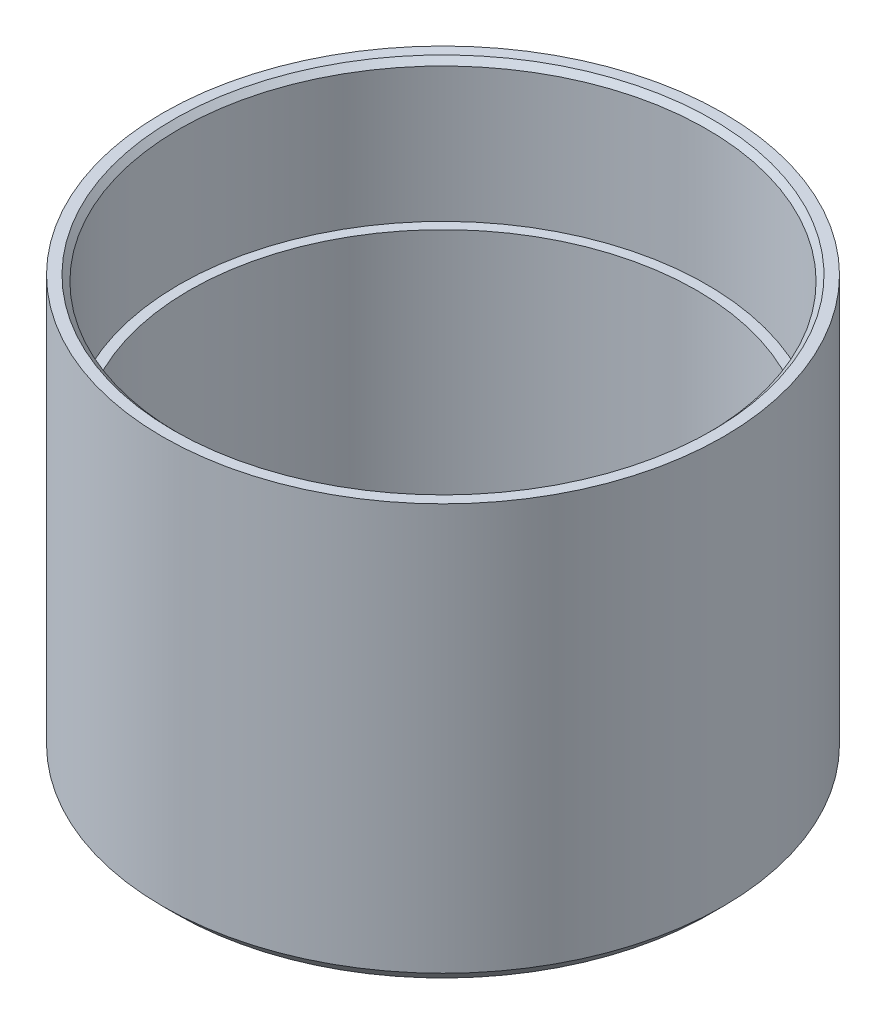
ISO-10303-21;
HEADER;
FILE_DESCRIPTION(('STEP AP214'),'2;1');
FILE_NAME('part.step','',(''),(''),'','','');
FILE_SCHEMA(('AUTOMOTIVE_DESIGN { 1 0 10303 214 1 1 1 1 }'));
ENDSEC;
DATA;
#1=APPLICATION_CONTEXT('core data for automotive mechanical design processes');
#2=APPLICATION_PROTOCOL_DEFINITION('international standard','automotive_design',2000,#1);
#3=PRODUCT_CONTEXT('',#1,'mechanical');
#4=PRODUCT('Part','Part','',(#3));
#5=PRODUCT_RELATED_PRODUCT_CATEGORY('part','',(#4));
#6=PRODUCT_DEFINITION_FORMATION('','',#4);
#7=PRODUCT_DEFINITION_CONTEXT('part definition',#1,'design');
#8=PRODUCT_DEFINITION('design','',#6,#7);
#9=PRODUCT_DEFINITION_SHAPE('','',#8);
#10=(LENGTH_UNIT() NAMED_UNIT(*) SI_UNIT(.MILLI.,.METRE.));
#11=(NAMED_UNIT(*) PLANE_ANGLE_UNIT() SI_UNIT($,.RADIAN.));
#12=(NAMED_UNIT(*) SI_UNIT($,.STERADIAN.) SOLID_ANGLE_UNIT());
#13=UNCERTAINTY_MEASURE_WITH_UNIT(LENGTH_MEASURE(1.E-05),#10,'distance_accuracy_value','');
#14=(GEOMETRIC_REPRESENTATION_CONTEXT(3) GLOBAL_UNCERTAINTY_ASSIGNED_CONTEXT((#13)) GLOBAL_UNIT_ASSIGNED_CONTEXT((#10,
#11,#12)) REPRESENTATION_CONTEXT('',''));
#15=CARTESIAN_POINT('',(0.,0.,0.));
#16=DIRECTION('',(0.,0.,1.));
#17=DIRECTION('',(1.,0.,0.));
#18=AXIS2_PLACEMENT_3D('',#15,#16,#17);
#19=CARTESIAN_POINT('',(0.,0.2500009407027,0.));
#20=DIRECTION('',(0.,1.,0.));
#21=DIRECTION('',(0.,0.,-1.));
#22=AXIS2_PLACEMENT_3D('',#19,#20,#21);
#23=CONICAL_SURFACE('',#22,9.749999341625,0.785398081393503);
#24=CARTESIAN_POINT('',(0.,0.5000007231241,0.));
#25=DIRECTION('',(0.,1.,0.));
#26=DIRECTION('',(1.,0.,0.));
#27=AXIS2_PLACEMENT_3D('',#24,#25,#26);
#28=CIRCLE('',#27,10.);
#29=CARTESIAN_POINT('',(0.,0.500001181601878,9.99999954152215));
#30=VERTEX_POINT('',#29);
#31=CARTESIAN_POINT('',(-10.,0.5000007231241,0.));
#32=VERTEX_POINT('',#31);
#33=EDGE_CURVE('E28',#30,#32,#28,.T.);
#34=ORIENTED_EDGE('',*,*,#33,.F.);
#35=DIRECTION('',(0.,-0.707106839172091,-0.707106723200999));
#36=VECTOR('',#35,1.);
#37=CARTESIAN_POINT('',(0.,0.2500009407027,9.74999934162498));
#38=LINE('',#37,#36);
#39=CARTESIAN_POINT('',(0.,4.38674569586128E-07,9.4999988805989));
#40=VERTEX_POINT('',#39);
#41=EDGE_CURVE('E11',#30,#40,#38,.T.);
#42=ORIENTED_EDGE('',*,*,#41,.T.);
#43=CARTESIAN_POINT('',(0.,4.386744922869E-07,0.));
#44=DIRECTION('',(0.,1.,0.));
#45=DIRECTION('',(1.,0.,0.));
#46=AXIS2_PLACEMENT_3D('',#43,#44,#45);
#47=CIRCLE('',#46,9.499998880599);
#48=EDGE_CURVE('E128',#40,#40,#47,.T.);
#49=ORIENTED_EDGE('',*,*,#48,.T.);
#50=ORIENTED_EDGE('',*,*,#41,.F.);
#51=CARTESIAN_POINT('',(0.,0.5000007231241,0.));
#52=DIRECTION('',(0.,1.,0.));
#53=DIRECTION('',(1.,0.,0.));
#54=AXIS2_PLACEMENT_3D('',#51,#52,#53);
#55=CIRCLE('',#54,10.);
#56=EDGE_CURVE('E124',#32,#30,#55,.T.);
#57=ORIENTED_EDGE('',*,*,#56,.F.);
#58=EDGE_LOOP('',(#34,#42,#49,#50,#57));
#59=FACE_BOUND('',#58,.T.);
#60=ADVANCED_FACE('F17',(#59),#23,.T.);
#61=CARTESIAN_POINT('',(0.,-0.75,0.));
#62=DIRECTION('',(0.,1.,0.));
#63=DIRECTION('',(1.,0.,0.));
#64=AXIS2_PLACEMENT_3D('',#61,#62,#63);
#65=CYLINDRICAL_SURFACE('',#64,10.);
#66=CARTESIAN_POINT('',(0.,15.,0.));
#67=DIRECTION('',(0.,1.,0.));
#68=DIRECTION('',(1.,0.,0.));
#69=AXIS2_PLACEMENT_3D('',#66,#67,#68);
#70=CIRCLE('',#69,10.);
#71=CARTESIAN_POINT('',(-10.,15.,0.));
#72=VERTEX_POINT('',#71);
#73=EDGE_CURVE('E117',#72,#72,#70,.T.);
#74=ORIENTED_EDGE('',*,*,#73,.F.);
#75=DIRECTION('',(0.,-1.,0.));
#76=VECTOR('',#75,1.);
#77=CARTESIAN_POINT('',(-10.,-0.75,0.));
#78=LINE('',#77,#76);
#79=EDGE_CURVE('E121',#72,#32,#78,.T.);
#80=ORIENTED_EDGE('',*,*,#79,.T.);
#81=ORIENTED_EDGE('',*,*,#56,.T.);
#82=ORIENTED_EDGE('',*,*,#33,.T.);
#83=ORIENTED_EDGE('',*,*,#79,.F.);
#84=EDGE_LOOP('',(#74,#80,#81,#82,#83));
#85=FACE_BOUND('',#84,.T.);
#86=ADVANCED_FACE('F155',(#85),#65,.T.);
#87=CARTESIAN_POINT('',(0.,15.,0.));
#88=DIRECTION('',(0.,1.,0.));
#89=DIRECTION('',(1.,0.,0.));
#90=AXIS2_PLACEMENT_3D('',#87,#88,#89);
#91=PLANE('',#90);
#92=CARTESIAN_POINT('',(0.,14.99999962999,0.));
#93=DIRECTION('',(0.,1.,0.));
#94=DIRECTION('',(1.,0.,0.));
#95=AXIS2_PLACEMENT_3D('',#92,#93,#94);
#96=CIRCLE('',#95,9.609999422916);
#97=CARTESIAN_POINT('',(0.,14.9999996299894,9.6099994229166));
#98=VERTEX_POINT('',#97);
#99=EDGE_CURVE('E97',#98,#98,#96,.T.);
#100=ORIENTED_EDGE('',*,*,#99,.F.);
#101=EDGE_LOOP('',(#100));
#102=FACE_BOUND('',#101,.T.);
#103=ORIENTED_EDGE('',*,*,#73,.T.);
#104=EDGE_LOOP('',(#103));
#105=FACE_BOUND('',#104,.T.);
#106=ADVANCED_FACE('F160',(#102,#105),#91,.T.);
#107=CARTESIAN_POINT('',(0.,14.90000011721,0.));
#108=DIRECTION('',(0.,1.,0.));
#109=DIRECTION('',(0.,0.,-1.));
#110=AXIS2_PLACEMENT_3D('',#107,#108,#109);
#111=CONICAL_SURFACE('',#110,9.509999912292,0.785398152623356);
#112=CARTESIAN_POINT('',(0.,14.80000093584,0.));
#113=DIRECTION('',(0.,1.,0.));
#114=DIRECTION('',(1.,0.,0.));
#115=AXIS2_PLACEMENT_3D('',#112,#113,#114);
#116=CIRCLE('',#115,9.41);
#117=CARTESIAN_POINT('',(0.,14.8000005693016,9.41000036653837));
#118=VERTEX_POINT('',#117);
#119=CARTESIAN_POINT('',(-9.41,14.80000093584,0.));
#120=VERTEX_POINT('',#119);
#121=EDGE_CURVE('E86',#118,#120,#116,.T.);
#122=ORIENTED_EDGE('',*,*,#121,.F.);
#123=DIRECTION('',(0.,0.707106788804981,0.707106773568114));
#124=VECTOR('',#123,1.);
#125=CARTESIAN_POINT('',(0.,14.90000011721,9.509999912292));
#126=LINE('',#125,#124);
#127=EDGE_CURVE('E92',#118,#98,#126,.T.);
#128=ORIENTED_EDGE('',*,*,#127,.T.);
#129=ORIENTED_EDGE('',*,*,#99,.T.);
#130=ORIENTED_EDGE('',*,*,#127,.F.);
#131=CARTESIAN_POINT('',(0.,14.80000093584,0.));
#132=DIRECTION('',(0.,1.,0.));
#133=DIRECTION('',(1.,0.,0.));
#134=AXIS2_PLACEMENT_3D('',#131,#132,#133);
#135=CIRCLE('',#134,9.41);
#136=EDGE_CURVE('E94',#120,#118,#135,.T.);
#137=ORIENTED_EDGE('',*,*,#136,.F.);
#138=EDGE_LOOP('',(#122,#128,#129,#130,#137));
#139=FACE_BOUND('',#138,.T.);
#140=ADVANCED_FACE('F93',(#139),#111,.F.);
#141=CARTESIAN_POINT('',(0.,-0.75,0.));
#142=DIRECTION('',(0.,1.,0.));
#143=DIRECTION('',(1.,0.,0.));
#144=AXIS2_PLACEMENT_3D('',#141,#142,#143);
#145=CYLINDRICAL_SURFACE('',#144,9.41);
#146=CARTESIAN_POINT('',(0.,10.,0.));
#147=DIRECTION('',(0.,1.,0.));
#148=DIRECTION('',(1.,0.,0.));
#149=AXIS2_PLACEMENT_3D('',#146,#147,#148);
#150=CIRCLE('',#149,9.41);
#151=CARTESIAN_POINT('',(-9.41,10.,0.));
#152=VERTEX_POINT('',#151);
#153=EDGE_CURVE('E109',#152,#152,#150,.T.);
#154=ORIENTED_EDGE('',*,*,#153,.F.);
#155=DIRECTION('',(0.,1.,0.));
#156=VECTOR('',#155,1.);
#157=CARTESIAN_POINT('',(-9.41,-0.75,0.));
#158=LINE('',#157,#156);
#159=EDGE_CURVE('E21',#152,#120,#158,.T.);
#160=ORIENTED_EDGE('',*,*,#159,.T.);
#161=ORIENTED_EDGE('',*,*,#136,.T.);
#162=ORIENTED_EDGE('',*,*,#121,.T.);
#163=ORIENTED_EDGE('',*,*,#159,.F.);
#164=EDGE_LOOP('',(#154,#160,#161,#162,#163));
#165=FACE_BOUND('',#164,.T.);
#166=ADVANCED_FACE('F103',(#165),#145,.F.);
#167=CARTESIAN_POINT('',(0.,10.,0.));
#168=DIRECTION('',(0.,1.,0.));
#169=DIRECTION('',(1.,0.,0.));
#170=AXIS2_PLACEMENT_3D('',#167,#168,#169);
#171=PLANE('',#170);
#172=CARTESIAN_POINT('',(0.,10.,0.));
#173=DIRECTION('',(0.,1.,0.));
#174=DIRECTION('',(1.,0.,0.));
#175=AXIS2_PLACEMENT_3D('',#172,#173,#174);
#176=CIRCLE('',#175,9.05);
#177=CARTESIAN_POINT('',(-9.05,10.,0.));
#178=VERTEX_POINT('',#177);
#179=EDGE_CURVE('E73',#178,#178,#176,.T.);
#180=ORIENTED_EDGE('',*,*,#179,.F.);
#181=EDGE_LOOP('',(#180));
#182=FACE_BOUND('',#181,.T.);
#183=ORIENTED_EDGE('',*,*,#153,.T.);
#184=EDGE_LOOP('',(#183));
#185=FACE_BOUND('',#184,.T.);
#186=ADVANCED_FACE('F19',(#182,#185),#171,.T.);
#187=CARTESIAN_POINT('',(0.,-0.75,0.));
#188=DIRECTION('',(0.,1.,0.));
#189=DIRECTION('',(1.,0.,0.));
#190=AXIS2_PLACEMENT_3D('',#187,#188,#189);
#191=CYLINDRICAL_SURFACE('',#190,9.05);
#192=CARTESIAN_POINT('',(0.,0.,0.));
#193=DIRECTION('',(0.,1.,0.));
#194=DIRECTION('',(1.,0.,0.));
#195=AXIS2_PLACEMENT_3D('',#192,#193,#194);
#196=CIRCLE('',#195,9.05);
#197=CARTESIAN_POINT('',(-9.05,0.,0.));
#198=VERTEX_POINT('',#197);
#199=EDGE_CURVE('E116',#198,#198,#196,.T.);
#200=ORIENTED_EDGE('',*,*,#199,.F.);
#201=DIRECTION('',(0.,1.,0.));
#202=VECTOR('',#201,1.);
#203=CARTESIAN_POINT('',(-9.05,-0.75,0.));
#204=LINE('',#203,#202);
#205=EDGE_CURVE('E64',#198,#178,#204,.T.);
#206=ORIENTED_EDGE('',*,*,#205,.T.);
#207=ORIENTED_EDGE('',*,*,#179,.T.);
#208=ORIENTED_EDGE('',*,*,#205,.F.);
#209=EDGE_LOOP('',(#200,#206,#207,#208));
#210=FACE_BOUND('',#209,.T.);
#211=ADVANCED_FACE('F144',(#210),#191,.F.);
#212=CARTESIAN_POINT('',(0.,0.,0.));
#213=DIRECTION('',(0.,1.,0.));
#214=DIRECTION('',(1.,0.,0.));
#215=AXIS2_PLACEMENT_3D('',#212,#213,#214);
#216=PLANE('',#215);
#217=ORIENTED_EDGE('',*,*,#199,.T.);
#218=EDGE_LOOP('',(#217));
#219=FACE_BOUND('',#218,.T.);
#220=ORIENTED_EDGE('',*,*,#48,.F.);
#221=EDGE_LOOP('',(#220));
#222=FACE_BOUND('',#221,.T.);
#223=ADVANCED_FACE('F142',(#219,#222),#216,.F.);
#224=CLOSED_SHELL('',(#60,#86,#106,#140,#166,#186,#211,#223));
#225=MANIFOLD_SOLID_BREP('B1',#224);
#226=ADVANCED_BREP_SHAPE_REPRESENTATION('',(#18,#225),#14);
#227=SHAPE_DEFINITION_REPRESENTATION(#9,#226);
ENDSEC;
END-ISO-10303-21;
